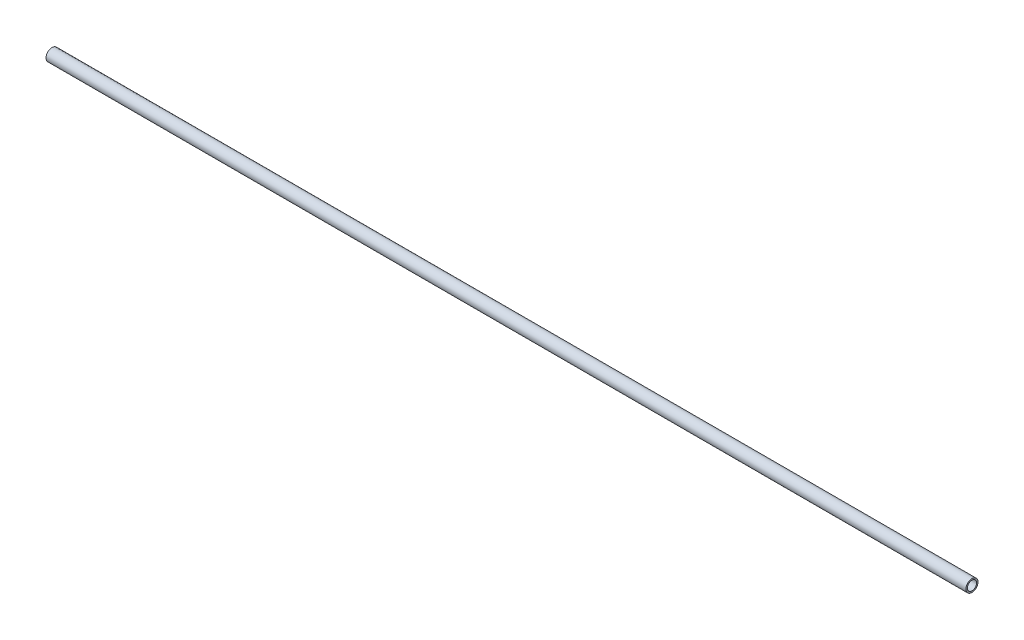
ISO-10303-21;
HEADER;
FILE_DESCRIPTION(('STEP AP214'),'2;1');
FILE_NAME('part.step','',(''),(''),'','','');
FILE_SCHEMA(('AUTOMOTIVE_DESIGN { 1 0 10303 214 1 1 1 1 }'));
ENDSEC;
DATA;
#1=APPLICATION_CONTEXT('core data for automotive mechanical design processes');
#2=APPLICATION_PROTOCOL_DEFINITION('international standard','automotive_design',2000,#1);
#3=PRODUCT_CONTEXT('',#1,'mechanical');
#4=PRODUCT('Part','Part','',(#3));
#5=PRODUCT_RELATED_PRODUCT_CATEGORY('part','',(#4));
#6=PRODUCT_DEFINITION_FORMATION('','',#4);
#7=PRODUCT_DEFINITION_CONTEXT('part definition',#1,'design');
#8=PRODUCT_DEFINITION('design','',#6,#7);
#9=PRODUCT_DEFINITION_SHAPE('','',#8);
#10=(LENGTH_UNIT() NAMED_UNIT(*) SI_UNIT(.MILLI.,.METRE.));
#11=(NAMED_UNIT(*) PLANE_ANGLE_UNIT() SI_UNIT($,.RADIAN.));
#12=(NAMED_UNIT(*) SI_UNIT($,.STERADIAN.) SOLID_ANGLE_UNIT());
#13=UNCERTAINTY_MEASURE_WITH_UNIT(LENGTH_MEASURE(1.E-05),#10,'distance_accuracy_value','');
#14=(GEOMETRIC_REPRESENTATION_CONTEXT(3) GLOBAL_UNCERTAINTY_ASSIGNED_CONTEXT((#13)) GLOBAL_UNIT_ASSIGNED_CONTEXT((#10,
#11,#12)) REPRESENTATION_CONTEXT('',''));
#15=CARTESIAN_POINT('',(0.,0.,0.));
#16=DIRECTION('',(0.,0.,1.));
#17=DIRECTION('',(1.,0.,0.));
#18=AXIS2_PLACEMENT_3D('',#15,#16,#17);
#19=CARTESIAN_POINT('',(1930.4,0.,0.));
#20=DIRECTION('',(1.,0.,0.));
#21=DIRECTION('',(0.,0.,-1.));
#22=AXIS2_PLACEMENT_3D('',#19,#20,#21);
#23=PLANE('',#22);
#24=CARTESIAN_POINT('',(1930.4,0.,0.));
#25=DIRECTION('',(1.,0.,0.));
#26=DIRECTION('',(0.,0.,-1.));
#27=AXIS2_PLACEMENT_3D('',#24,#25,#26);
#28=CIRCLE('',#27,12.7);
#29=CARTESIAN_POINT('',(1930.4,0.,12.7));
#30=VERTEX_POINT('',#29);
#31=EDGE_CURVE('E10',#30,#30,#28,.T.);
#32=ORIENTED_EDGE('',*,*,#31,.T.);
#33=EDGE_LOOP('',(#32));
#34=FACE_BOUND('',#33,.T.);
#35=CARTESIAN_POINT('',(1930.4,0.,0.));
#36=DIRECTION('',(1.,0.,0.));
#37=DIRECTION('',(0.,0.,-1.));
#38=AXIS2_PLACEMENT_3D('',#35,#36,#37);
#39=CIRCLE('',#38,9.652);
#40=CARTESIAN_POINT('',(1930.4,0.,9.652));
#41=VERTEX_POINT('',#40);
#42=EDGE_CURVE('E48',#41,#41,#39,.T.);
#43=ORIENTED_EDGE('',*,*,#42,.F.);
#44=EDGE_LOOP('',(#43));
#45=FACE_BOUND('',#44,.T.);
#46=ADVANCED_FACE('F34',(#34,#45),#23,.T.);
#47=CARTESIAN_POINT('',(0.,0.,0.));
#48=DIRECTION('',(1.,0.,0.));
#49=DIRECTION('',(0.,0.,-1.));
#50=AXIS2_PLACEMENT_3D('',#47,#48,#49);
#51=PLANE('',#50);
#52=CARTESIAN_POINT('',(0.,0.,0.));
#53=DIRECTION('',(1.,0.,0.));
#54=DIRECTION('',(0.,0.,-1.));
#55=AXIS2_PLACEMENT_3D('',#52,#53,#54);
#56=CIRCLE('',#55,12.7);
#57=CARTESIAN_POINT('',(0.,0.,12.7));
#58=VERTEX_POINT('',#57);
#59=EDGE_CURVE('E38',#58,#58,#56,.T.);
#60=ORIENTED_EDGE('',*,*,#59,.F.);
#61=EDGE_LOOP('',(#60));
#62=FACE_BOUND('',#61,.T.);
#63=CARTESIAN_POINT('',(0.,0.,0.));
#64=DIRECTION('',(1.,0.,0.));
#65=DIRECTION('',(0.,0.,-1.));
#66=AXIS2_PLACEMENT_3D('',#63,#64,#65);
#67=CIRCLE('',#66,9.652);
#68=CARTESIAN_POINT('',(0.,0.,9.652));
#69=VERTEX_POINT('',#68);
#70=EDGE_CURVE('E50',#69,#69,#67,.T.);
#71=ORIENTED_EDGE('',*,*,#70,.T.);
#72=EDGE_LOOP('',(#71));
#73=FACE_BOUND('',#72,.T.);
#74=ADVANCED_FACE('F61',(#62,#73),#51,.F.);
#75=CARTESIAN_POINT('',(1930.4,0.,0.));
#76=DIRECTION('',(-1.,0.,0.));
#77=DIRECTION('',(0.,0.,1.));
#78=AXIS2_PLACEMENT_3D('',#75,#76,#77);
#79=CYLINDRICAL_SURFACE('',#78,12.7);
#80=CARTESIAN_POINT('',(1930.4,0.,12.7));
#81=CARTESIAN_POINT('',(1910.29166666667,0.,12.7));
#82=CARTESIAN_POINT('',(1890.18333333333,0.,12.7));
#83=CARTESIAN_POINT('',(1849.96666666667,0.,12.7));
#84=CARTESIAN_POINT('',(1829.85833333333,0.,12.7));
#85=CARTESIAN_POINT('',(1789.64166666667,0.,12.7));
#86=CARTESIAN_POINT('',(1769.53333333333,0.,12.7));
#87=CARTESIAN_POINT('',(1729.31666666667,0.,12.7));
#88=CARTESIAN_POINT('',(1709.20833333333,0.,12.7));
#89=CARTESIAN_POINT('',(1668.99166666667,0.,12.7));
#90=CARTESIAN_POINT('',(1648.88333333333,0.,12.7));
#91=CARTESIAN_POINT('',(1608.66666666667,0.,12.7));
#92=CARTESIAN_POINT('',(1588.55833333333,0.,12.7));
#93=CARTESIAN_POINT('',(1548.34166666667,0.,12.7));
#94=CARTESIAN_POINT('',(1528.23333333333,0.,12.7));
#95=CARTESIAN_POINT('',(1488.01666666667,0.,12.7));
#96=CARTESIAN_POINT('',(1467.90833333333,0.,12.7));
#97=CARTESIAN_POINT('',(1427.69166666667,0.,12.7));
#98=CARTESIAN_POINT('',(1407.58333333333,0.,12.7));
#99=CARTESIAN_POINT('',(1367.36666666667,0.,12.7));
#100=CARTESIAN_POINT('',(1347.25833333333,0.,12.7));
#101=CARTESIAN_POINT('',(1307.04166666667,0.,12.7));
#102=CARTESIAN_POINT('',(1286.93333333333,0.,12.7));
#103=CARTESIAN_POINT('',(1246.71666666667,0.,12.7));
#104=CARTESIAN_POINT('',(1226.60833333333,0.,12.7));
#105=CARTESIAN_POINT('',(1186.39166666667,0.,12.7));
#106=CARTESIAN_POINT('',(1166.28333333333,0.,12.7));
#107=CARTESIAN_POINT('',(1126.06666666667,0.,12.7));
#108=CARTESIAN_POINT('',(1105.95833333333,0.,12.7));
#109=CARTESIAN_POINT('',(1065.74166666667,0.,12.7));
#110=CARTESIAN_POINT('',(1045.63333333333,0.,12.7));
#111=CARTESIAN_POINT('',(1005.41666666667,0.,12.7));
#112=CARTESIAN_POINT('',(985.308333333333,0.,12.7));
#113=CARTESIAN_POINT('',(945.091666666667,0.,12.7));
#114=CARTESIAN_POINT('',(924.983333333333,0.,12.7));
#115=CARTESIAN_POINT('',(884.766666666667,0.,12.7));
#116=CARTESIAN_POINT('',(864.658333333333,0.,12.7));
#117=CARTESIAN_POINT('',(824.441666666667,0.,12.7));
#118=CARTESIAN_POINT('',(804.333333333333,0.,12.7));
#119=CARTESIAN_POINT('',(764.116666666667,0.,12.7));
#120=CARTESIAN_POINT('',(744.008333333333,0.,12.7));
#121=CARTESIAN_POINT('',(703.791666666667,0.,12.7));
#122=CARTESIAN_POINT('',(683.683333333333,0.,12.7));
#123=CARTESIAN_POINT('',(643.466666666667,0.,12.7));
#124=CARTESIAN_POINT('',(623.358333333333,0.,12.7));
#125=CARTESIAN_POINT('',(583.141666666667,0.,12.7));
#126=CARTESIAN_POINT('',(563.033333333333,0.,12.7));
#127=CARTESIAN_POINT('',(522.816666666667,0.,12.7));
#128=CARTESIAN_POINT('',(502.708333333333,0.,12.7));
#129=CARTESIAN_POINT('',(462.491666666667,0.,12.7));
#130=CARTESIAN_POINT('',(442.383333333333,0.,12.7));
#131=CARTESIAN_POINT('',(402.166666666667,0.,12.7));
#132=CARTESIAN_POINT('',(382.058333333333,0.,12.7));
#133=CARTESIAN_POINT('',(341.841666666667,0.,12.7));
#134=CARTESIAN_POINT('',(321.733333333333,0.,12.7));
#135=CARTESIAN_POINT('',(281.516666666667,0.,12.7));
#136=CARTESIAN_POINT('',(261.408333333333,0.,12.7));
#137=CARTESIAN_POINT('',(221.191666666667,0.,12.7));
#138=CARTESIAN_POINT('',(201.083333333333,0.,12.7));
#139=CARTESIAN_POINT('',(160.866666666667,0.,12.7));
#140=CARTESIAN_POINT('',(140.758333333333,0.,12.7));
#141=CARTESIAN_POINT('',(100.541666666667,0.,12.7));
#142=CARTESIAN_POINT('',(80.4333333333333,0.,12.7));
#143=CARTESIAN_POINT('',(40.2166666666666,0.,12.7));
#144=CARTESIAN_POINT('',(20.1083333333333,0.,12.7));
#145=CARTESIAN_POINT('',(0.,0.,12.7));
#146=B_SPLINE_CURVE_WITH_KNOTS('',3,(#80,#81,#82,#83,#84,#85,#86,#87,#88,#89,#90,#91,#92,#93,
#94,#95,#96,#97,#98,#99,#100,#101,#102,#103,#104,#105,#106,#107,#108,#109,#110,#111,#112,#113,
#114,#115,#116,#117,#118,#119,#120,#121,#122,#123,#124,#125,#126,#127,#128,#129,#130,#131,#132,
#133,#134,#135,#136,#137,#138,#139,#140,#141,#142,#143,#144,#145),.UNSPECIFIED.,.F.,.F.,(4,2,2,
2,2,2,2,2,2,2,2,2,2,2,2,2,2,2,2,2,2,2,2,2,2,2,2,2,2,2,2,2,4),(0.,60.3250000000002,120.65,
180.975,241.3,301.625,361.95,422.275,482.6,542.925,603.25,663.575,723.9,784.225,844.55,904.875,
965.2,1025.525,1085.85,1146.175,1206.5,1266.825,1327.15,1387.475,1447.8,1508.125,1568.45,
1628.775,1689.1,1749.425,1809.75,1870.075,1930.4),.UNSPECIFIED.);
#147=EDGE_CURVE('BSEAM36',#30,#58,#146,.T.);
#148=ORIENTED_EDGE('',*,*,#31,.F.);
#149=ORIENTED_EDGE('',*,*,#59,.T.);
#150=ORIENTED_EDGE('',*,*,#147,.T.);
#151=ORIENTED_EDGE('',*,*,#147,.F.);
#152=EDGE_LOOP('',(#148,#150,#149,#151));
#153=FACE_BOUND('',#152,.T.);
#154=ADVANCED_FACE('F36',(#153),#79,.T.);
#155=CARTESIAN_POINT('',(1930.4,0.,0.));
#156=DIRECTION('',(-1.,0.,0.));
#157=DIRECTION('',(0.,0.,1.));
#158=AXIS2_PLACEMENT_3D('',#155,#156,#157);
#159=CYLINDRICAL_SURFACE('',#158,9.652);
#160=CARTESIAN_POINT('',(1930.4,0.,9.652));
#161=CARTESIAN_POINT('',(1910.29166666667,0.,9.652));
#162=CARTESIAN_POINT('',(1890.18333333333,0.,9.652));
#163=CARTESIAN_POINT('',(1849.96666666667,0.,9.652));
#164=CARTESIAN_POINT('',(1829.85833333333,0.,9.652));
#165=CARTESIAN_POINT('',(1789.64166666667,0.,9.652));
#166=CARTESIAN_POINT('',(1769.53333333333,0.,9.652));
#167=CARTESIAN_POINT('',(1729.31666666667,0.,9.652));
#168=CARTESIAN_POINT('',(1709.20833333333,0.,9.652));
#169=CARTESIAN_POINT('',(1668.99166666667,0.,9.652));
#170=CARTESIAN_POINT('',(1648.88333333333,0.,9.652));
#171=CARTESIAN_POINT('',(1608.66666666667,0.,9.652));
#172=CARTESIAN_POINT('',(1588.55833333333,0.,9.652));
#173=CARTESIAN_POINT('',(1548.34166666667,0.,9.652));
#174=CARTESIAN_POINT('',(1528.23333333333,0.,9.652));
#175=CARTESIAN_POINT('',(1488.01666666667,0.,9.652));
#176=CARTESIAN_POINT('',(1467.90833333333,0.,9.652));
#177=CARTESIAN_POINT('',(1427.69166666667,0.,9.652));
#178=CARTESIAN_POINT('',(1407.58333333333,0.,9.652));
#179=CARTESIAN_POINT('',(1367.36666666667,0.,9.652));
#180=CARTESIAN_POINT('',(1347.25833333333,0.,9.652));
#181=CARTESIAN_POINT('',(1307.04166666667,0.,9.652));
#182=CARTESIAN_POINT('',(1286.93333333333,0.,9.652));
#183=CARTESIAN_POINT('',(1246.71666666667,0.,9.652));
#184=CARTESIAN_POINT('',(1226.60833333333,0.,9.652));
#185=CARTESIAN_POINT('',(1186.39166666667,0.,9.652));
#186=CARTESIAN_POINT('',(1166.28333333333,0.,9.652));
#187=CARTESIAN_POINT('',(1126.06666666667,0.,9.652));
#188=CARTESIAN_POINT('',(1105.95833333333,0.,9.652));
#189=CARTESIAN_POINT('',(1065.74166666667,0.,9.652));
#190=CARTESIAN_POINT('',(1045.63333333333,0.,9.652));
#191=CARTESIAN_POINT('',(1005.41666666667,0.,9.652));
#192=CARTESIAN_POINT('',(985.308333333333,0.,9.652));
#193=CARTESIAN_POINT('',(945.091666666667,0.,9.652));
#194=CARTESIAN_POINT('',(924.983333333333,0.,9.652));
#195=CARTESIAN_POINT('',(884.766666666667,0.,9.652));
#196=CARTESIAN_POINT('',(864.658333333333,0.,9.652));
#197=CARTESIAN_POINT('',(824.441666666667,0.,9.652));
#198=CARTESIAN_POINT('',(804.333333333333,0.,9.652));
#199=CARTESIAN_POINT('',(764.116666666667,0.,9.652));
#200=CARTESIAN_POINT('',(744.008333333333,0.,9.652));
#201=CARTESIAN_POINT('',(703.791666666667,0.,9.652));
#202=CARTESIAN_POINT('',(683.683333333333,0.,9.652));
#203=CARTESIAN_POINT('',(643.466666666667,0.,9.652));
#204=CARTESIAN_POINT('',(623.358333333333,0.,9.652));
#205=CARTESIAN_POINT('',(583.141666666667,0.,9.652));
#206=CARTESIAN_POINT('',(563.033333333333,0.,9.652));
#207=CARTESIAN_POINT('',(522.816666666667,0.,9.652));
#208=CARTESIAN_POINT('',(502.708333333333,0.,9.652));
#209=CARTESIAN_POINT('',(462.491666666667,0.,9.652));
#210=CARTESIAN_POINT('',(442.383333333333,0.,9.652));
#211=CARTESIAN_POINT('',(402.166666666667,0.,9.652));
#212=CARTESIAN_POINT('',(382.058333333333,0.,9.652));
#213=CARTESIAN_POINT('',(341.841666666667,0.,9.652));
#214=CARTESIAN_POINT('',(321.733333333333,0.,9.652));
#215=CARTESIAN_POINT('',(281.516666666667,0.,9.652));
#216=CARTESIAN_POINT('',(261.408333333333,0.,9.652));
#217=CARTESIAN_POINT('',(221.191666666667,0.,9.652));
#218=CARTESIAN_POINT('',(201.083333333333,0.,9.652));
#219=CARTESIAN_POINT('',(160.866666666667,0.,9.652));
#220=CARTESIAN_POINT('',(140.758333333333,0.,9.652));
#221=CARTESIAN_POINT('',(100.541666666667,0.,9.652));
#222=CARTESIAN_POINT('',(80.4333333333333,0.,9.652));
#223=CARTESIAN_POINT('',(40.2166666666666,0.,9.652));
#224=CARTESIAN_POINT('',(20.1083333333333,0.,9.652));
#225=CARTESIAN_POINT('',(0.,0.,9.652));
#226=B_SPLINE_CURVE_WITH_KNOTS('',3,(#160,#161,#162,#163,#164,#165,#166,#167,#168,#169,#170,
#171,#172,#173,#174,#175,#176,#177,#178,#179,#180,#181,#182,#183,#184,#185,#186,#187,#188,#189,
#190,#191,#192,#193,#194,#195,#196,#197,#198,#199,#200,#201,#202,#203,#204,#205,#206,#207,#208,
#209,#210,#211,#212,#213,#214,#215,#216,#217,#218,#219,#220,#221,#222,#223,#224,#225),
.UNSPECIFIED.,.F.,.F.,(4,2,2,2,2,2,2,2,2,2,2,2,2,2,2,2,2,2,2,2,2,2,2,2,2,2,2,2,2,2,2,2,4),(0.,
60.3250000000002,120.65,180.975,241.3,301.625,361.95,422.275,482.6,542.925,603.25,663.575,723.9,
784.225,844.55,904.875,965.2,1025.525,1085.85,1146.175,1206.5,1266.825,1327.15,1387.475,1447.8,
1508.125,1568.45,1628.775,1689.1,1749.425,1809.75,1870.075,1930.4),.UNSPECIFIED.);
#227=EDGE_CURVE('BSEAM57',#41,#69,#226,.T.);
#228=ORIENTED_EDGE('',*,*,#42,.T.);
#229=ORIENTED_EDGE('',*,*,#70,.F.);
#230=ORIENTED_EDGE('',*,*,#227,.T.);
#231=ORIENTED_EDGE('',*,*,#227,.F.);
#232=EDGE_LOOP('',(#228,#230,#229,#231));
#233=FACE_BOUND('',#232,.T.);
#234=ADVANCED_FACE('F57',(#233),#159,.F.);
#235=CLOSED_SHELL('',(#46,#74,#154,#234));
#236=MANIFOLD_SOLID_BREP('B2',#235);
#237=ADVANCED_BREP_SHAPE_REPRESENTATION('',(#18,#236),#14);
#238=SHAPE_DEFINITION_REPRESENTATION(#9,#237);
ENDSEC;
END-ISO-10303-21;
